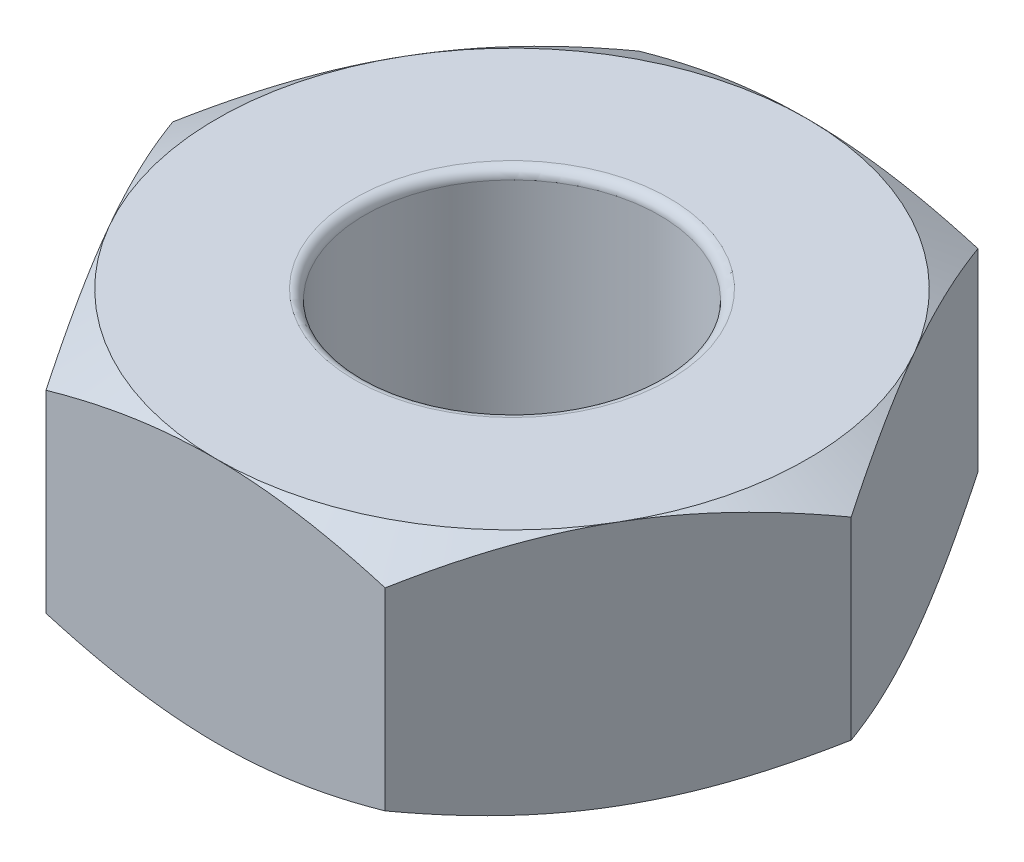
ISO-10303-21;
HEADER;
FILE_DESCRIPTION(('STEP AP214'),'2;1');
FILE_NAME('part.step','',(''),(''),'','','');
FILE_SCHEMA(('AUTOMOTIVE_DESIGN { 1 0 10303 214 1 1 1 1 }'));
ENDSEC;
DATA;
#1=APPLICATION_CONTEXT('core data for automotive mechanical design processes');
#2=APPLICATION_PROTOCOL_DEFINITION('international standard','automotive_design',2000,#1);
#3=PRODUCT_CONTEXT('',#1,'mechanical');
#4=PRODUCT('Part','Part','',(#3));
#5=PRODUCT_RELATED_PRODUCT_CATEGORY('part','',(#4));
#6=PRODUCT_DEFINITION_FORMATION('','',#4);
#7=PRODUCT_DEFINITION_CONTEXT('part definition',#1,'design');
#8=PRODUCT_DEFINITION('design','',#6,#7);
#9=PRODUCT_DEFINITION_SHAPE('','',#8);
#10=(LENGTH_UNIT() NAMED_UNIT(*) SI_UNIT(.MILLI.,.METRE.));
#11=(NAMED_UNIT(*) PLANE_ANGLE_UNIT() SI_UNIT($,.RADIAN.));
#12=(NAMED_UNIT(*) SI_UNIT($,.STERADIAN.) SOLID_ANGLE_UNIT());
#13=UNCERTAINTY_MEASURE_WITH_UNIT(LENGTH_MEASURE(1.E-05),#10,'distance_accuracy_value','');
#14=(GEOMETRIC_REPRESENTATION_CONTEXT(3) GLOBAL_UNCERTAINTY_ASSIGNED_CONTEXT((#13)) GLOBAL_UNIT_ASSIGNED_CONTEXT((#10,
#11,#12)) REPRESENTATION_CONTEXT('',''));
#15=CARTESIAN_POINT('',(0.,0.,0.));
#16=DIRECTION('',(0.,0.,1.));
#17=DIRECTION('',(1.,0.,0.));
#18=AXIS2_PLACEMENT_3D('',#15,#16,#17);
#19=CARTESIAN_POINT('',(1.73203276631956,1.25,0.00790546617274001));
#20=DIRECTION('',(-0.868298494671231,0.,0.496042058853555));
#21=DIRECTION('',(0.496042058853555,0.,0.868298494671231));
#22=AXIS2_PLACEMENT_3D('',#19,#20,#21);
#23=PLANE('',#22);
#24=CARTESIAN_POINT('',(0.872748461580158,0.134041094989057,-1.49623164273341));
#25=CARTESIAN_POINT('',(0.910505710212889,0.112057292544015,-1.4301393395394));
#26=CARTESIAN_POINT('',(0.948588874613615,0.0920633406820825,-1.36347653599026));
#27=CARTESIAN_POINT('',(1.02541474509064,0.057162583785243,-1.22899643194186));
#28=CARTESIAN_POINT('',(1.064158816934,0.0422681272790877,-1.16117674073104));
#29=CARTESIAN_POINT('',(1.14116676684112,0.0190812125993855,-1.02637791513023));
#30=CARTESIAN_POINT('',(1.17941879171193,0.0106344590776262,-0.95941952920179));
#31=CARTESIAN_POINT('',(1.25610296259679,0.000548155951366177,-0.825187463682338));
#32=CARTESIAN_POINT('',(1.29453482961624,-0.00109974319241183,-0.757914272458362));
#33=CARTESIAN_POINT('',(1.36635570965204,0.00231624023372548,-0.632195170805615));
#34=CARTESIAN_POINT('',(1.39975543758004,0.00654137931515019,-0.57373050442362));
#35=CARTESIAN_POINT('',(1.46633727950204,0.0199363876633552,-0.457182094704229));
#36=CARTESIAN_POINT('',(1.49951916295446,0.029110839044217,-0.399098754919133));
#37=CARTESIAN_POINT('',(1.56623844428902,0.0520477516574739,-0.282309763916563));
#38=CARTESIAN_POINT('',(1.59976739156689,0.0659075065061089,-0.223618905087837));
#39=CARTESIAN_POINT('',(1.6663250172453,0.0973642729897473,-0.107112884773709));
#40=CARTESIAN_POINT('',(1.69935454930335,0.114953886453083,-0.0492962290006346));
#41=CARTESIAN_POINT('',(1.73214702243353,0.134041094989057,0.00810546617273983));
#42=B_SPLINE_CURVE_WITH_KNOTS('',3,(#24,#25,#26,#27,#28,#29,#30,#31,#32,#33,#34,#35,#36,#37,#38,
#39,#40,#41),.UNSPECIFIED.,.F.,.F.,(4,2,2,2,2,2,2,2,4),(0.,0.237777780775827,0.476127338905026,
0.708576945847722,0.940741000874616,1.14294310244298,1.3453327264544,1.55221352830934,
1.75868775774927),.UNSPECIFIED.);
#43=CARTESIAN_POINT('',(0.872862717694132,0.133974596215561,-1.49603164273341));
#44=VERTEX_POINT('',#43);
#45=CARTESIAN_POINT('',(1.30244774200685,0.,-0.744063088280333));
#46=VERTEX_POINT('',#45);
#47=EDGE_CURVE('E50',#44,#46,#42,.T.);
#48=ORIENTED_EDGE('',*,*,#47,.F.);
#49=DIRECTION('',(0.,-1.,0.));
#50=VECTOR('',#49,1.);
#51=CARTESIAN_POINT('',(0.872862717694132,1.25,-1.49603164273341));
#52=LINE('',#51,#50);
#53=CARTESIAN_POINT('',(0.872862717694132,1.11602540378444,-1.49603164273341));
#54=VERTEX_POINT('',#53);
#55=EDGE_CURVE('E168',#54,#44,#52,.T.);
#56=ORIENTED_EDGE('',*,*,#55,.F.);
#57=CARTESIAN_POINT('',(1.73214702243353,1.11595890501094,0.00810546617273997));
#58=CARTESIAN_POINT('',(1.6943897738008,1.13794270745599,-0.0579868370212648));
#59=CARTESIAN_POINT('',(1.65630660940008,1.15793665931792,-0.124649640570409));
#60=CARTESIAN_POINT('',(1.57948073892305,1.19283741621476,-0.259129744618806));
#61=CARTESIAN_POINT('',(1.54073666707969,1.20773187272091,-0.326949435829627));
#62=CARTESIAN_POINT('',(1.46372871717257,1.23091878740061,-0.461748261430432));
#63=CARTESIAN_POINT('',(1.42547669230176,1.23936554092237,-0.528706647358876));
#64=CARTESIAN_POINT('',(1.3487925214169,1.24945184404863,-0.662938712878327));
#65=CARTESIAN_POINT('',(1.31036065439745,1.25109974319241,-0.730211904102304));
#66=CARTESIAN_POINT('',(1.23853977436165,1.24768375976627,-0.855931005755051));
#67=CARTESIAN_POINT('',(1.20514004643365,1.24345862068485,-0.914395672137046));
#68=CARTESIAN_POINT('',(1.13855820451165,1.23006361233664,-1.03094408185644));
#69=CARTESIAN_POINT('',(1.10537632105923,1.22088916095578,-1.08902742164153));
#70=CARTESIAN_POINT('',(1.03865703972467,1.19795224834253,-1.2058164126441));
#71=CARTESIAN_POINT('',(1.0051280924468,1.18409249349389,-1.26450727147283));
#72=CARTESIAN_POINT('',(0.938570466768395,1.15263572701025,-1.38101329178696));
#73=CARTESIAN_POINT('',(0.905540934710341,1.13504611354692,-1.43882994756003));
#74=CARTESIAN_POINT('',(0.872748461580158,1.11595890501094,-1.49623164273341));
#75=B_SPLINE_CURVE_WITH_KNOTS('',3,(#57,#58,#59,#60,#61,#62,#63,#64,#65,#66,#67,#68,#69,#70,#71,
#72,#73,#74),.UNSPECIFIED.,.F.,.F.,(4,2,2,2,2,2,2,2,4),(0.,0.237777780775827,0.476127338905026,
0.708576945847721,0.940741000874615,1.14294310244298,1.3453327264544,1.55221352830934,
1.75868775774927),.UNSPECIFIED.);
#76=CARTESIAN_POINT('',(1.30244774200685,1.25,-0.744063088280333));
#77=VERTEX_POINT('',#76);
#78=EDGE_CURVE('E197',#77,#54,#75,.T.);
#79=ORIENTED_EDGE('',*,*,#78,.F.);
#80=CARTESIAN_POINT('',(1.73203276631956,1.11602540378444,0.00790546617274002));
#81=VERTEX_POINT('',#80);
#82=EDGE_CURVE('E159',#81,#77,#75,.T.);
#83=ORIENTED_EDGE('',*,*,#82,.F.);
#84=DIRECTION('',(0.,-1.,0.));
#85=VECTOR('',#84,1.);
#86=CARTESIAN_POINT('',(1.73203276631956,1.25,0.00790546617274001));
#87=LINE('',#86,#85);
#88=CARTESIAN_POINT('',(1.73203276631956,0.13397459621556,0.00790546617274003));
#89=VERTEX_POINT('',#88);
#90=EDGE_CURVE('E154',#81,#89,#87,.T.);
#91=ORIENTED_EDGE('',*,*,#90,.T.);
#92=EDGE_CURVE('E147',#46,#89,#42,.T.);
#93=ORIENTED_EDGE('',*,*,#92,.F.);
#94=EDGE_LOOP('',(#48,#56,#79,#83,#91,#93));
#95=FACE_BOUND('',#94,.T.);
#96=ADVANCED_FACE('F35',(#95),#23,.F.);
#97=CARTESIAN_POINT('',(0.872862717694132,1.25,-1.49603164273341));
#98=DIRECTION('',(-0.00456422302290133,0.,0.999989583879851));
#99=DIRECTION('',(0.999989583879851,0.,0.00456422302290133));
#100=AXIS2_PLACEMENT_3D('',#97,#98,#99);
#101=PLANE('',#100);
#102=CARTESIAN_POINT('',(-0.859370048625427,0.134032336843676,-1.50393802176026));
#103=CARTESIAN_POINT('',(-0.78325432273423,0.112049253599252,-1.50359060899305));
#104=CARTESIAN_POINT('',(-0.706481574441378,0.0920560656525497,-1.50324019739783));
#105=CARTESIAN_POINT('',(-0.55160653396821,0.0571568942661073,-1.50253330580936));
#106=CARTESIAN_POINT('',(-0.473501488815772,0.042263258358237,-1.5021768132508));
#107=CARTESIAN_POINT('',(-0.318259416559701,0.0190779659506211,-1.50146824642997));
#108=CARTESIAN_POINT('',(-0.241146282491906,0.010632019051491,-1.50111628122198));
#109=CARTESIAN_POINT('',(-0.0865569641758218,0.000547274998430949,-1.50041069374674));
#110=CARTESIAN_POINT('',(-0.0090813422368268,-0.00109987103491523,-1.50005707404603));
#111=CARTESIAN_POINT('',(0.135699906808123,0.00231730301084968,-1.49939625325267));
#112=CARTESIAN_POINT('',(0.203027150280744,0.00654258809525845,-1.49908895349707));
#113=CARTESIAN_POINT('',(0.337242977375251,0.0199372020205897,-1.49847635614812));
#114=CARTESIAN_POINT('',(0.404131096383658,0.0291111114063577,-1.49817106067539));
#115=CARTESIAN_POINT('',(0.538623901257774,0.0520463318820197,-1.49755719912491));
#116=CARTESIAN_POINT('',(0.606211555210683,0.0659049148023972,-1.49724871078542));
#117=CARTESIAN_POINT('',(0.740378508496831,0.0973588921011749,-1.49663633650976));
#118=CARTESIAN_POINT('',(0.806959528199758,0.114946890521898,-1.49633244272135));
#119=CARTESIAN_POINT('',(0.873062717694132,0.134032336843676,-1.49603072987929));
#120=B_SPLINE_CURVE_WITH_KNOTS('',3,(#102,#103,#104,#105,#106,#107,#108,#109,#110,#111,#112,
#113,#114,#115,#116,#117,#118,#119),.UNSPECIFIED.,.F.,.F.,(4,2,2,2,2,2,2,2,4),(0.,
0.237775703539285,0.476123127546934,0.708570855718079,0.940733054645261,1.14292173280993,
1.34529788277262,1.55216449729656,1.75862464009075),.UNSPECIFIED.);
#121=CARTESIAN_POINT('',(-0.859170048625427,0.13397459621556,-1.50393710890615));
#122=VERTEX_POINT('',#121);
#123=CARTESIAN_POINT('',(0.006846334534352,0.,-1.49998437581978));
#124=VERTEX_POINT('',#123);
#125=EDGE_CURVE('E58',#122,#124,#120,.T.);
#126=ORIENTED_EDGE('',*,*,#125,.F.);
#127=DIRECTION('',(0.,-1.,0.));
#128=VECTOR('',#127,1.);
#129=CARTESIAN_POINT('',(-0.859170048625427,1.25,-1.50393710890615));
#130=LINE('',#129,#128);
#131=CARTESIAN_POINT('',(-0.859170048625427,1.11602540378444,-1.50393710890615));
#132=VERTEX_POINT('',#131);
#133=EDGE_CURVE('E165',#132,#122,#130,.T.);
#134=ORIENTED_EDGE('',*,*,#133,.F.);
#135=CARTESIAN_POINT('',(0.873062717694132,1.11596766315632,-1.49603072987929));
#136=CARTESIAN_POINT('',(0.796946991802935,1.13795074640075,-1.4963781426465));
#137=CARTESIAN_POINT('',(0.720174243510083,1.15794393434745,-1.49672855424172));
#138=CARTESIAN_POINT('',(0.565299203036915,1.19284310573389,-1.49743544583019));
#139=CARTESIAN_POINT('',(0.487194157884477,1.20773674164176,-1.49779193838875));
#140=CARTESIAN_POINT('',(0.331952085628406,1.23092203404938,-1.49850050520958));
#141=CARTESIAN_POINT('',(0.254838951560611,1.23936798094851,-1.49885247041757));
#142=CARTESIAN_POINT('',(0.100249633244527,1.24945272500157,-1.49955805789281));
#143=CARTESIAN_POINT('',(0.0227740113055318,1.25109987103491,-1.49991167759352));
#144=CARTESIAN_POINT('',(-0.122007237739418,1.24768269698915,-1.50057249838689));
#145=CARTESIAN_POINT('',(-0.189334481212039,1.24345741190474,-1.50087979814248));
#146=CARTESIAN_POINT('',(-0.323550308306545,1.23006279797941,-1.50149239549143));
#147=CARTESIAN_POINT('',(-0.390438427314953,1.22088888859364,-1.50179769096417));
#148=CARTESIAN_POINT('',(-0.524931232189069,1.19795366811798,-1.50241155251464));
#149=CARTESIAN_POINT('',(-0.592518886141978,1.1840950851976,-1.50272004085413));
#150=CARTESIAN_POINT('',(-0.726685839428126,1.15264110789883,-1.50333241512979));
#151=CARTESIAN_POINT('',(-0.793266859131053,1.1350531094781,-1.50363630891821));
#152=CARTESIAN_POINT('',(-0.859370048625427,1.11596766315632,-1.50393802176026));
#153=B_SPLINE_CURVE_WITH_KNOTS('',3,(#135,#136,#137,#138,#139,#140,#141,#142,#143,#144,#145,
#146,#147,#148,#149,#150,#151,#152),.UNSPECIFIED.,.F.,.F.,(4,2,2,2,2,2,2,2,4),(0.,
0.237775703539285,0.476123127546934,0.708570855718079,0.940733054645262,1.14292173280993,
1.34529788277262,1.55216449729656,1.75862464009075),.UNSPECIFIED.);
#154=CARTESIAN_POINT('',(0.006846334534352,1.25,-1.49998437581978));
#155=VERTEX_POINT('',#154);
#156=EDGE_CURVE('E230',#155,#132,#153,.T.);
#157=ORIENTED_EDGE('',*,*,#156,.F.);
#158=EDGE_CURVE('E384',#54,#155,#153,.T.);
#159=ORIENTED_EDGE('',*,*,#158,.F.);
#160=ORIENTED_EDGE('',*,*,#55,.T.);
#161=EDGE_CURVE('E254',#124,#44,#120,.T.);
#162=ORIENTED_EDGE('',*,*,#161,.F.);
#163=EDGE_LOOP('',(#126,#134,#157,#159,#160,#162));
#164=FACE_BOUND('',#163,.T.);
#165=ADVANCED_FACE('F240',(#164),#101,.F.);
#166=CARTESIAN_POINT('',(-0.859170048625427,1.25,-1.50393710890615));
#167=DIRECTION('',(0.86373427164833,0.,0.503947525026295));
#168=DIRECTION('',(0.503947525026295,0.,-0.86373427164833));
#169=AXIS2_PLACEMENT_3D('',#166,#167,#168);
#170=PLANE('',#169);
#171=CARTESIAN_POINT('',(-1.73214945672807,0.134041446423134,-0.0077054661727401));
#172=CARTESIAN_POINT('',(-1.69379045713047,0.112057615119517,-0.0734503720076487));
#173=CARTESIAN_POINT('',(-1.65510034755009,0.0920636326048036,-0.139762779468459));
#174=CARTESIAN_POINT('',(-1.57705007451575,0.0571628120878931,-0.273536024466032));
#175=CARTESIAN_POINT('',(-1.53768852352175,0.0422683226544488,-0.340999240158934));
#176=CARTESIAN_POINT('',(-1.45945326865712,0.0190813428794644,-0.475089532345997));
#177=CARTESIAN_POINT('',(-1.42059160693042,0.0106345569911395,-0.541695969365021));
#178=CARTESIAN_POINT('',(-1.34268529045905,0.000548191305338819,-0.675222481893666));
#179=CARTESIAN_POINT('',(-1.30364091915789,-0.00109973805789227,-0.742142071598986));
#180=CARTESIAN_POINT('',(-1.23067531973265,0.00231619759161642,-0.867200506743905));
#181=CARTESIAN_POINT('',(-1.19674320625145,0.00654133081331652,-0.925358008999022));
#182=CARTESIAN_POINT('',(-1.12910006208653,0.0199363549867208,-1.04129409153904));
#183=CARTESIAN_POINT('',(-1.09538926562148,0.0291108281154816,-1.09907227038794));
#184=CARTESIAN_POINT('',(-1.02760648981092,0.0520478086278354,-1.21524767276139));
#185=CARTESIAN_POINT('',(-0.993543095828079,0.065907610501913,-1.27363018151585));
#186=CARTESIAN_POINT('',(-0.925924552723069,0.0973644889060436,-1.38952409939089));
#187=CARTESIAN_POINT('',(-0.892368536327445,0.114954167175581,-1.44703699496347));
#188=CARTESIAN_POINT('',(-0.859053358216914,0.134041446423135,-1.50413710890615));
#189=B_SPLINE_CURVE_WITH_KNOTS('',3,(#171,#172,#173,#174,#175,#176,#177,#178,#179,#180,#181,
#182,#183,#184,#185,#186,#187,#188),.UNSPECIFIED.,.F.,.F.,(4,2,2,2,2,2,2,2,4),(0.,
0.237777864128074,0.476127507892117,0.708577190223434,0.940741319729197,1.14294395992385,
1.34533412459391,1.55221549572996,1.75869029041058),.UNSPECIFIED.);
#190=CARTESIAN_POINT('',(-1.73203276631956,0.133974596215559,-0.00790546617274003));
#191=VERTEX_POINT('',#190);
#192=CARTESIAN_POINT('',(-1.2956014074725,0.,-0.755921287539443));
#193=VERTEX_POINT('',#192);
#194=EDGE_CURVE('E252',#191,#193,#189,.T.);
#195=ORIENTED_EDGE('',*,*,#194,.F.);
#196=DIRECTION('',(0.,-1.,0.));
#197=VECTOR('',#196,1.);
#198=CARTESIAN_POINT('',(-1.73203276631956,1.25,-0.00790546617274004));
#199=LINE('',#198,#197);
#200=CARTESIAN_POINT('',(-1.73203276631956,1.11602540378444,-0.00790546617274001));
#201=VERTEX_POINT('',#200);
#202=EDGE_CURVE('E156',#201,#191,#199,.T.);
#203=ORIENTED_EDGE('',*,*,#202,.F.);
#204=CARTESIAN_POINT('',(-0.859053358216914,1.11595855357687,-1.50413710890615));
#205=CARTESIAN_POINT('',(-0.897412357814511,1.13794238488048,-1.43839220307124));
#206=CARTESIAN_POINT('',(-0.936102467394899,1.1579363673952,-1.37207979561043));
#207=CARTESIAN_POINT('',(-1.01415274042923,1.19283718791211,-1.23830655061285));
#208=CARTESIAN_POINT('',(-1.05351429142323,1.20773167734555,-1.17084333491995));
#209=CARTESIAN_POINT('',(-1.13174954628787,1.23091865712054,-1.03675304273289));
#210=CARTESIAN_POINT('',(-1.17061120801457,1.23936544300886,-0.970146605713865));
#211=CARTESIAN_POINT('',(-1.24851752448594,1.24945180869466,-0.836620093185221));
#212=CARTESIAN_POINT('',(-1.28756189578709,1.25109973805789,-0.7697005034799));
#213=CARTESIAN_POINT('',(-1.36052749521233,1.24768380240838,-0.644642068334981));
#214=CARTESIAN_POINT('',(-1.39445960869354,1.24345866918668,-0.586484566079864));
#215=CARTESIAN_POINT('',(-1.46210275285846,1.23006364501328,-0.470548483539845));
#216=CARTESIAN_POINT('',(-1.49581354932351,1.22088917188452,-0.41277030469095));
#217=CARTESIAN_POINT('',(-1.56359632513407,1.19795219137217,-0.296594902317499));
#218=CARTESIAN_POINT('',(-1.59765971911691,1.18409238949809,-0.238212393563034));
#219=CARTESIAN_POINT('',(-1.66527826222192,1.15263551109396,-0.122318475687994));
#220=CARTESIAN_POINT('',(-1.69883427861754,1.13504583282442,-0.064805580115421));
#221=CARTESIAN_POINT('',(-1.73214945672807,1.11595855357687,-0.00770546617273987));
#222=B_SPLINE_CURVE_WITH_KNOTS('',3,(#204,#205,#206,#207,#208,#209,#210,#211,#212,#213,#214,
#215,#216,#217,#218,#219,#220,#221),.UNSPECIFIED.,.F.,.F.,(4,2,2,2,2,2,2,2,4),(0.,
0.237777864128074,0.476127507892117,0.708577190223434,0.940741319729198,1.14294395992386,
1.34533412459391,1.55221549572996,1.75869029041058),.UNSPECIFIED.);
#223=CARTESIAN_POINT('',(-1.29560140747249,1.25,-0.755921287539442));
#224=VERTEX_POINT('',#223);
#225=EDGE_CURVE('E222',#224,#201,#222,.T.);
#226=ORIENTED_EDGE('',*,*,#225,.F.);
#227=EDGE_CURVE('E228',#132,#224,#222,.T.);
#228=ORIENTED_EDGE('',*,*,#227,.F.);
#229=ORIENTED_EDGE('',*,*,#133,.T.);
#230=EDGE_CURVE('E246',#193,#122,#189,.T.);
#231=ORIENTED_EDGE('',*,*,#230,.F.);
#232=EDGE_LOOP('',(#195,#203,#226,#228,#229,#231));
#233=FACE_BOUND('',#232,.T.);
#234=ADVANCED_FACE('F236',(#233),#170,.F.);
#235=CARTESIAN_POINT('',(-1.73203276631956,1.25,-0.00790546617274004));
#236=DIRECTION('',(0.868298494671231,0.,-0.496042058853555));
#237=DIRECTION('',(-0.496042058853555,0.,-0.868298494671231));
#238=AXIS2_PLACEMENT_3D('',#235,#236,#237);
#239=PLANE('',#238);
#240=CARTESIAN_POINT('',(-0.872748461580157,0.134041094989056,1.49623164273341));
#241=CARTESIAN_POINT('',(-0.910505710212888,0.112057292544014,1.4301393395394));
#242=CARTESIAN_POINT('',(-0.948588874613614,0.0920633406820821,1.36347653599026));
#243=CARTESIAN_POINT('',(-1.02541474509064,0.0571625837852426,1.22899643194186));
#244=CARTESIAN_POINT('',(-1.064158816934,0.0422681272790873,1.16117674073104));
#245=CARTESIAN_POINT('',(-1.14116676684112,0.019081212599385,1.02637791513023));
#246=CARTESIAN_POINT('',(-1.17941879171193,0.0106344590776256,0.95941952920179));
#247=CARTESIAN_POINT('',(-1.25610296259679,0.000548155951365539,0.825187463682339));
#248=CARTESIAN_POINT('',(-1.29453482961624,-0.00109974319241247,0.757914272458362));
#249=CARTESIAN_POINT('',(-1.36635570965204,0.00231624023372487,0.632195170805615));
#250=CARTESIAN_POINT('',(-1.39975543758004,0.00654137931514962,0.57373050442362));
#251=CARTESIAN_POINT('',(-1.46633727950204,0.0199363876633546,0.457182094704229));
#252=CARTESIAN_POINT('',(-1.49951916295446,0.0291108390442163,0.399098754919133));
#253=CARTESIAN_POINT('',(-1.56623844428902,0.0520477516574731,0.282309763916563));
#254=CARTESIAN_POINT('',(-1.59976739156689,0.0659075065061081,0.223618905087837));
#255=CARTESIAN_POINT('',(-1.6663250172453,0.0973642729897466,0.107112884773709));
#256=CARTESIAN_POINT('',(-1.69935454930335,0.114953886453082,0.0492962290006345));
#257=CARTESIAN_POINT('',(-1.73214702243353,0.134041094989056,-0.00810546617273993));
#258=B_SPLINE_CURVE_WITH_KNOTS('',3,(#240,#241,#242,#243,#244,#245,#246,#247,#248,#249,#250,
#251,#252,#253,#254,#255,#256,#257),.UNSPECIFIED.,.F.,.F.,(4,2,2,2,2,2,2,2,4),(0.,
0.237777780775827,0.476127338905026,0.708576945847721,0.940741000874615,1.14294310244298,
1.3453327264544,1.55221352830934,1.75868775774927),.UNSPECIFIED.);
#259=CARTESIAN_POINT('',(-0.872862717694131,0.13397459621556,1.49603164273341));
#260=VERTEX_POINT('',#259);
#261=CARTESIAN_POINT('',(-1.30244774200685,0.,0.744063088280333));
#262=VERTEX_POINT('',#261);
#263=EDGE_CURVE('E298',#260,#262,#258,.T.);
#264=ORIENTED_EDGE('',*,*,#263,.F.);
#265=DIRECTION('',(0.,-1.,0.));
#266=VECTOR('',#265,1.);
#267=CARTESIAN_POINT('',(-0.872862717694131,1.25,1.49603164273341));
#268=LINE('',#267,#266);
#269=CARTESIAN_POINT('',(-0.872862717694131,1.11602540378444,1.49603164273341));
#270=VERTEX_POINT('',#269);
#271=EDGE_CURVE('E153',#270,#260,#268,.T.);
#272=ORIENTED_EDGE('',*,*,#271,.F.);
#273=CARTESIAN_POINT('',(-1.73214702243353,1.11595890501094,-0.00810546617274003));
#274=CARTESIAN_POINT('',(-1.6943897738008,1.13794270745599,0.0579868370212645));
#275=CARTESIAN_POINT('',(-1.65630660940008,1.15793665931792,0.124649640570408));
#276=CARTESIAN_POINT('',(-1.57948073892305,1.19283741621476,0.259129744618806));
#277=CARTESIAN_POINT('',(-1.54073666707969,1.20773187272091,0.326949435829627));
#278=CARTESIAN_POINT('',(-1.46372871717257,1.23091878740062,0.461748261430432));
#279=CARTESIAN_POINT('',(-1.42547669230176,1.23936554092237,0.528706647358875));
#280=CARTESIAN_POINT('',(-1.3487925214169,1.24945184404863,0.662938712878327));
#281=CARTESIAN_POINT('',(-1.31036065439745,1.25109974319241,0.730211904102304));
#282=CARTESIAN_POINT('',(-1.23853977436165,1.24768375976628,0.85593100575505));
#283=CARTESIAN_POINT('',(-1.20514004643365,1.24345862068485,0.914395672137045));
#284=CARTESIAN_POINT('',(-1.13855820451165,1.23006361233665,1.03094408185644));
#285=CARTESIAN_POINT('',(-1.10537632105923,1.22088916095578,1.08902742164153));
#286=CARTESIAN_POINT('',(-1.03865703972467,1.19795224834253,1.2058164126441));
#287=CARTESIAN_POINT('',(-1.0051280924468,1.18409249349389,1.26450727147283));
#288=CARTESIAN_POINT('',(-0.938570466768394,1.15263572701025,1.38101329178696));
#289=CARTESIAN_POINT('',(-0.90554093471034,1.13504611354692,1.43882994756003));
#290=CARTESIAN_POINT('',(-0.872748461580157,1.11595890501094,1.49623164273341));
#291=B_SPLINE_CURVE_WITH_KNOTS('',3,(#273,#274,#275,#276,#277,#278,#279,#280,#281,#282,#283,
#284,#285,#286,#287,#288,#289,#290),.UNSPECIFIED.,.F.,.F.,(4,2,2,2,2,2,2,2,4),(0.,
0.237777780775827,0.476127338905026,0.708576945847721,0.940741000874614,1.14294310244298,
1.3453327264544,1.55221352830934,1.75868775774927),.UNSPECIFIED.);
#292=CARTESIAN_POINT('',(-1.30244774200685,1.25,0.744063088280332));
#293=VERTEX_POINT('',#292);
#294=EDGE_CURVE('E215',#293,#270,#291,.T.);
#295=ORIENTED_EDGE('',*,*,#294,.F.);
#296=EDGE_CURVE('E229',#201,#293,#291,.T.);
#297=ORIENTED_EDGE('',*,*,#296,.F.);
#298=ORIENTED_EDGE('',*,*,#202,.T.);
#299=EDGE_CURVE('E253',#262,#191,#258,.T.);
#300=ORIENTED_EDGE('',*,*,#299,.F.);
#301=EDGE_LOOP('',(#264,#272,#295,#297,#298,#300));
#302=FACE_BOUND('',#301,.T.);
#303=ADVANCED_FACE('F239',(#302),#239,.F.);
#304=CARTESIAN_POINT('',(-0.872862717694131,1.25,1.49603164273341));
#305=DIRECTION('',(0.00456422302290121,0.,-0.999989583879851));
#306=DIRECTION('',(-0.999989583879851,0.,-0.00456422302290121));
#307=AXIS2_PLACEMENT_3D('',#304,#305,#306);
#308=PLANE('',#307);
#309=CARTESIAN_POINT('',(0.859370048625428,0.134032336843676,1.50393802176026));
#310=CARTESIAN_POINT('',(0.783254322734231,0.112049253599252,1.50359060899305));
#311=CARTESIAN_POINT('',(0.706481574441379,0.0920560656525496,1.50324019739783));
#312=CARTESIAN_POINT('',(0.551606533968211,0.0571568942661072,1.50253330580936));
#313=CARTESIAN_POINT('',(0.473501488815773,0.0422632583582368,1.5021768132508));
#314=CARTESIAN_POINT('',(0.318259416559702,0.0190779659506209,1.50146824642997));
#315=CARTESIAN_POINT('',(0.241146282491907,0.0106320190514908,1.50111628122198));
#316=CARTESIAN_POINT('',(0.0865569641758231,0.000547274998430733,1.50041069374674));
#317=CARTESIAN_POINT('',(0.00908134223682806,-0.00109987103491553,1.50005707404603));
#318=CARTESIAN_POINT('',(-0.135699906808122,0.00231730301084937,1.49939625325267));
#319=CARTESIAN_POINT('',(-0.203027150280743,0.00654258809525819,1.49908895349707));
#320=CARTESIAN_POINT('',(-0.337242977375249,0.0199372020205894,1.49847635614812));
#321=CARTESIAN_POINT('',(-0.404131096383657,0.0291111114063572,1.49817106067539));
#322=CARTESIAN_POINT('',(-0.538623901257773,0.0520463318820191,1.49755719912491));
#323=CARTESIAN_POINT('',(-0.606211555210682,0.0659049148023967,1.49724871078542));
#324=CARTESIAN_POINT('',(-0.74037850849683,0.0973588921011744,1.49663633650976));
#325=CARTESIAN_POINT('',(-0.806959528199757,0.114946890521898,1.49633244272135));
#326=CARTESIAN_POINT('',(-0.873062717694131,0.134032336843676,1.49603072987929));
#327=B_SPLINE_CURVE_WITH_KNOTS('',3,(#309,#310,#311,#312,#313,#314,#315,#316,#317,#318,#319,
#320,#321,#322,#323,#324,#325,#326),.UNSPECIFIED.,.F.,.F.,(4,2,2,2,2,2,2,2,4),(0.,
0.237775703539285,0.476123127546934,0.708570855718079,0.940733054645262,1.14292173280993,
1.34529788277262,1.55216449729656,1.75862464009075),.UNSPECIFIED.);
#328=CARTESIAN_POINT('',(0.859170048625428,0.13397459621556,1.50393710890615));
#329=VERTEX_POINT('',#328);
#330=CARTESIAN_POINT('',(-0.00684633453435181,0.,1.49998437581978));
#331=VERTEX_POINT('',#330);
#332=EDGE_CURVE('E129',#329,#331,#327,.T.);
#333=ORIENTED_EDGE('',*,*,#332,.F.);
#334=DIRECTION('',(0.,-1.,0.));
#335=VECTOR('',#334,1.);
#336=CARTESIAN_POINT('',(0.859170048625428,1.25,1.50393710890615));
#337=LINE('',#336,#335);
#338=CARTESIAN_POINT('',(0.859170048625428,1.11602540378444,1.50393710890615));
#339=VERTEX_POINT('',#338);
#340=EDGE_CURVE('E144',#339,#329,#337,.T.);
#341=ORIENTED_EDGE('',*,*,#340,.F.);
#342=CARTESIAN_POINT('',(-0.873062717694131,1.11596766315632,1.49603072987929));
#343=CARTESIAN_POINT('',(-0.796946991802934,1.13795074640075,1.4963781426465));
#344=CARTESIAN_POINT('',(-0.720174243510082,1.15794393434745,1.49672855424172));
#345=CARTESIAN_POINT('',(-0.565299203036914,1.19284310573389,1.49743544583019));
#346=CARTESIAN_POINT('',(-0.487194157884476,1.20773674164176,1.49779193838875));
#347=CARTESIAN_POINT('',(-0.331952085628406,1.23092203404938,1.49850050520958));
#348=CARTESIAN_POINT('',(-0.254838951560611,1.23936798094851,1.49885247041757));
#349=CARTESIAN_POINT('',(-0.100249633244527,1.24945272500157,1.49955805789281));
#350=CARTESIAN_POINT('',(-0.0227740113055315,1.25109987103492,1.49991167759352));
#351=CARTESIAN_POINT('',(0.122007237739418,1.24768269698915,1.50057249838689));
#352=CARTESIAN_POINT('',(0.189334481212039,1.24345741190474,1.50087979814248));
#353=CARTESIAN_POINT('',(0.323550308306546,1.23006279797941,1.50149239549143));
#354=CARTESIAN_POINT('',(0.390438427314954,1.22088888859364,1.50179769096416));
#355=CARTESIAN_POINT('',(0.52493123218907,1.19795366811798,1.50241155251464));
#356=CARTESIAN_POINT('',(0.592518886141978,1.1840950851976,1.50272004085413));
#357=CARTESIAN_POINT('',(0.726685839428127,1.15264110789883,1.50333241512979));
#358=CARTESIAN_POINT('',(0.793266859131054,1.1350531094781,1.5036363089182));
#359=CARTESIAN_POINT('',(0.859370048625428,1.11596766315632,1.50393802176026));
#360=B_SPLINE_CURVE_WITH_KNOTS('',3,(#342,#343,#344,#345,#346,#347,#348,#349,#350,#351,#352,
#353,#354,#355,#356,#357,#358,#359),.UNSPECIFIED.,.F.,.F.,(4,2,2,2,2,2,2,2,4),(0.,
0.237775703539285,0.476123127546934,0.708570855718078,0.940733054645261,1.14292173280993,
1.34529788277262,1.55216449729656,1.75862464009075),.UNSPECIFIED.);
#361=CARTESIAN_POINT('',(-0.00684633453435181,1.25,1.49998437581978));
#362=VERTEX_POINT('',#361);
#363=EDGE_CURVE('E208',#362,#339,#360,.T.);
#364=ORIENTED_EDGE('',*,*,#363,.F.);
#365=EDGE_CURVE('E268',#270,#362,#360,.T.);
#366=ORIENTED_EDGE('',*,*,#365,.F.);
#367=ORIENTED_EDGE('',*,*,#271,.T.);
#368=EDGE_CURVE('E146',#331,#260,#327,.T.);
#369=ORIENTED_EDGE('',*,*,#368,.F.);
#370=EDGE_LOOP('',(#333,#341,#364,#366,#367,#369));
#371=FACE_BOUND('',#370,.T.);
#372=ADVANCED_FACE('F142',(#371),#308,.F.);
#373=CARTESIAN_POINT('',(0.859170048625428,1.25,1.50393710890615));
#374=DIRECTION('',(-0.86373427164833,0.,-0.503947525026296));
#375=DIRECTION('',(-0.503947525026296,0.,0.86373427164833));
#376=AXIS2_PLACEMENT_3D('',#373,#374,#375);
#377=PLANE('',#376);
#378=CARTESIAN_POINT('',(1.73214945672807,0.134041446423135,0.00770546617274001));
#379=CARTESIAN_POINT('',(1.69379045713048,0.112057615119518,0.0734503720076488));
#380=CARTESIAN_POINT('',(1.65510034755009,0.0920636326048044,0.139762779468459));
#381=CARTESIAN_POINT('',(1.57705007451575,0.0571628120878938,0.273536024466032));
#382=CARTESIAN_POINT('',(1.53768852352175,0.0422683226544495,0.340999240158934));
#383=CARTESIAN_POINT('',(1.45945326865712,0.0190813428794651,0.475089532345997));
#384=CARTESIAN_POINT('',(1.42059160693042,0.0106345569911402,0.541695969365022));
#385=CARTESIAN_POINT('',(1.34268529045905,0.000548191305339533,0.675222481893666));
#386=CARTESIAN_POINT('',(1.30364091915789,-0.00109973805789161,0.742142071598987));
#387=CARTESIAN_POINT('',(1.23067531973265,0.00231619759161702,0.867200506743905));
#388=CARTESIAN_POINT('',(1.19674320625145,0.00654133081331708,0.925358008999022));
#389=CARTESIAN_POINT('',(1.12910006208653,0.0199363549867213,1.04129409153904));
#390=CARTESIAN_POINT('',(1.09538926562148,0.029110828115482,1.09907227038794));
#391=CARTESIAN_POINT('',(1.02760648981092,0.0520478086278357,1.21524767276139));
#392=CARTESIAN_POINT('',(0.99354309582808,0.0659076105019133,1.27363018151585));
#393=CARTESIAN_POINT('',(0.925924552723071,0.0973644889060437,1.38952409939089));
#394=CARTESIAN_POINT('',(0.892368536327446,0.114954167175581,1.44703699496346));
#395=CARTESIAN_POINT('',(0.859053358216915,0.134041446423135,1.50413710890615));
#396=B_SPLINE_CURVE_WITH_KNOTS('',3,(#378,#379,#380,#381,#382,#383,#384,#385,#386,#387,#388,
#389,#390,#391,#392,#393,#394,#395),.UNSPECIFIED.,.F.,.F.,(4,2,2,2,2,2,2,2,4),(0.,
0.237777864128074,0.476127507892117,0.708577190223435,0.940741319729198,1.14294395992386,
1.34533412459391,1.55221549572996,1.75869029041058),.UNSPECIFIED.);
#397=CARTESIAN_POINT('',(1.29560140747249,0.,0.755921287539443));
#398=VERTEX_POINT('',#397);
#399=EDGE_CURVE('E136',#89,#398,#396,.T.);
#400=ORIENTED_EDGE('',*,*,#399,.F.);
#401=ORIENTED_EDGE('',*,*,#90,.F.);
#402=CARTESIAN_POINT('',(0.859053358216915,1.11595855357687,1.50413710890615));
#403=CARTESIAN_POINT('',(0.897412357814512,1.13794238488048,1.43839220307124));
#404=CARTESIAN_POINT('',(0.936102467394901,1.1579363673952,1.37207979561043));
#405=CARTESIAN_POINT('',(1.01415274042923,1.19283718791211,1.23830655061285));
#406=CARTESIAN_POINT('',(1.05351429142324,1.20773167734555,1.17084333491995));
#407=CARTESIAN_POINT('',(1.13174954628787,1.23091865712054,1.03675304273289));
#408=CARTESIAN_POINT('',(1.17061120801457,1.23936544300886,0.970146605713865));
#409=CARTESIAN_POINT('',(1.24851752448594,1.24945180869466,0.83662009318522));
#410=CARTESIAN_POINT('',(1.2875618957871,1.25109973805789,0.7697005034799));
#411=CARTESIAN_POINT('',(1.36052749521234,1.24768380240838,0.644642068334981));
#412=CARTESIAN_POINT('',(1.39445960869354,1.24345866918668,0.586484566079864));
#413=CARTESIAN_POINT('',(1.46210275285846,1.23006364501328,0.470548483539845));
#414=CARTESIAN_POINT('',(1.49581354932351,1.22088917188452,0.41277030469095));
#415=CARTESIAN_POINT('',(1.56359632513407,1.19795219137216,0.2965949023175));
#416=CARTESIAN_POINT('',(1.59765971911691,1.18409238949809,0.238212393563034));
#417=CARTESIAN_POINT('',(1.66527826222192,1.15263551109396,0.122318475687995));
#418=CARTESIAN_POINT('',(1.69883427861754,1.13504583282442,0.0648055801154214));
#419=CARTESIAN_POINT('',(1.73214945672807,1.11595855357687,0.00770546617274019));
#420=B_SPLINE_CURVE_WITH_KNOTS('',3,(#402,#403,#404,#405,#406,#407,#408,#409,#410,#411,#412,
#413,#414,#415,#416,#417,#418,#419),.UNSPECIFIED.,.F.,.F.,(4,2,2,2,2,2,2,2,4),(0.,
0.237777864128074,0.476127507892117,0.708577190223434,0.940741319729198,1.14294395992386,
1.34533412459391,1.55221549572996,1.75869029041058),.UNSPECIFIED.);
#421=CARTESIAN_POINT('',(1.29560140747249,1.25,0.755921287539443));
#422=VERTEX_POINT('',#421);
#423=EDGE_CURVE('E171',#422,#81,#420,.T.);
#424=ORIENTED_EDGE('',*,*,#423,.F.);
#425=EDGE_CURVE('E152',#339,#422,#420,.T.);
#426=ORIENTED_EDGE('',*,*,#425,.F.);
#427=ORIENTED_EDGE('',*,*,#340,.T.);
#428=EDGE_CURVE('E126',#398,#329,#396,.T.);
#429=ORIENTED_EDGE('',*,*,#428,.F.);
#430=EDGE_LOOP('',(#400,#401,#424,#426,#427,#429));
#431=FACE_BOUND('',#430,.T.);
#432=ADVANCED_FACE('F150',(#431),#377,.F.);
#433=CARTESIAN_POINT('',(0.,0.,0.));
#434=DIRECTION('',(0.,1.,0.));
#435=DIRECTION('',(0.,0.,1.));
#436=AXIS2_PLACEMENT_3D('',#433,#434,#435);
#437=PLANE('',#436);
#438=CARTESIAN_POINT('',(0.,0.,0.));
#439=DIRECTION('',(0.,1.,0.));
#440=DIRECTION('',(0.,0.,1.));
#441=AXIS2_PLACEMENT_3D('',#438,#439,#440);
#442=CIRCLE('',#441,0.800000000000001);
#443=CARTESIAN_POINT('',(0.,0.,0.800000000000001));
#444=VERTEX_POINT('',#443);
#445=EDGE_CURVE('E335',#444,#444,#442,.T.);
#446=ORIENTED_EDGE('',*,*,#445,.T.);
#447=EDGE_LOOP('',(#446));
#448=FACE_BOUND('',#447,.T.);
#449=CARTESIAN_POINT('',(0.,0.,0.));
#450=DIRECTION('',(0.,1.,0.));
#451=DIRECTION('',(0.,0.,1.));
#452=AXIS2_PLACEMENT_3D('',#449,#450,#451);
#453=CIRCLE('',#452,1.5);
#454=EDGE_CURVE('E288',#398,#46,#453,.T.);
#455=ORIENTED_EDGE('',*,*,#454,.F.);
#456=EDGE_CURVE('E131',#331,#398,#453,.T.);
#457=ORIENTED_EDGE('',*,*,#456,.F.);
#458=EDGE_CURVE('E290',#262,#331,#453,.T.);
#459=ORIENTED_EDGE('',*,*,#458,.F.);
#460=EDGE_CURVE('E277',#193,#262,#453,.T.);
#461=ORIENTED_EDGE('',*,*,#460,.F.);
#462=EDGE_CURVE('E283',#124,#193,#453,.T.);
#463=ORIENTED_EDGE('',*,*,#462,.F.);
#464=CARTESIAN_POINT('',(0.,0.,0.));
#465=DIRECTION('',(0.,-1.,0.));
#466=DIRECTION('',(0.,0.,-1.));
#467=AXIS2_PLACEMENT_3D('',#464,#465,#466);
#468=CIRCLE('',#467,1.5);
#469=EDGE_CURVE('E137',#124,#46,#468,.T.);
#470=ORIENTED_EDGE('',*,*,#469,.T.);
#471=EDGE_LOOP('',(#455,#457,#459,#461,#463,#470));
#472=FACE_BOUND('',#471,.T.);
#473=ADVANCED_FACE('F289',(#448,#472),#437,.F.);
#474=CARTESIAN_POINT('',(0.,1.25,0.));
#475=DIRECTION('',(0.,1.,0.));
#476=DIRECTION('',(0.,0.,1.));
#477=AXIS2_PLACEMENT_3D('',#474,#475,#476);
#478=PLANE('',#477);
#479=CARTESIAN_POINT('',(0.,1.25,0.));
#480=DIRECTION('',(0.,1.,0.));
#481=DIRECTION('',(0.,0.,1.));
#482=AXIS2_PLACEMENT_3D('',#479,#480,#481);
#483=CIRCLE('',#482,0.800000000000001);
#484=CARTESIAN_POINT('',(0.,1.25,0.800000000000001));
#485=VERTEX_POINT('',#484);
#486=EDGE_CURVE('E12',#485,#485,#483,.F.);
#487=ORIENTED_EDGE('',*,*,#486,.T.);
#488=EDGE_LOOP('',(#487));
#489=FACE_BOUND('',#488,.T.);
#490=CARTESIAN_POINT('',(0.,1.25,0.));
#491=DIRECTION('',(0.,1.,0.));
#492=DIRECTION('',(0.,0.,1.));
#493=AXIS2_PLACEMENT_3D('',#490,#491,#492);
#494=CIRCLE('',#493,1.5);
#495=EDGE_CURVE('E263',#362,#422,#494,.T.);
#496=ORIENTED_EDGE('',*,*,#495,.T.);
#497=EDGE_CURVE('E260',#422,#77,#494,.T.);
#498=ORIENTED_EDGE('',*,*,#497,.T.);
#499=EDGE_CURVE('E262',#77,#155,#494,.T.);
#500=ORIENTED_EDGE('',*,*,#499,.T.);
#501=EDGE_CURVE('E269',#155,#224,#494,.T.);
#502=ORIENTED_EDGE('',*,*,#501,.T.);
#503=EDGE_CURVE('E272',#224,#293,#494,.T.);
#504=ORIENTED_EDGE('',*,*,#503,.T.);
#505=EDGE_CURVE('E270',#293,#362,#494,.T.);
#506=ORIENTED_EDGE('',*,*,#505,.T.);
#507=EDGE_LOOP('',(#496,#498,#500,#502,#504,#506));
#508=FACE_BOUND('',#507,.T.);
#509=ADVANCED_FACE('F343',(#489,#508),#478,.T.);
#510=CARTESIAN_POINT('',(0.,1.25,0.));
#511=DIRECTION('',(0.,-1.,0.));
#512=DIRECTION('',(0.,0.,-1.));
#513=AXIS2_PLACEMENT_3D('',#510,#511,#512);
#514=CYLINDRICAL_SURFACE('',#513,0.750000000000001);
#515=CARTESIAN_POINT('',(0.,0.0499999999999999,0.));
#516=DIRECTION('',(0.,1.,0.));
#517=DIRECTION('',(0.,0.,1.));
#518=AXIS2_PLACEMENT_3D('',#515,#516,#517);
#519=CIRCLE('',#518,0.750000000000001);
#520=CARTESIAN_POINT('',(0.,0.0499999999999999,0.750000000000001));
#521=VERTEX_POINT('',#520);
#522=EDGE_CURVE('E43',#521,#521,#519,.F.);
#523=ORIENTED_EDGE('',*,*,#522,.T.);
#524=EDGE_LOOP('',(#523));
#525=FACE_BOUND('',#524,.T.);
#526=CARTESIAN_POINT('',(0.,1.2,0.));
#527=DIRECTION('',(0.,1.,0.));
#528=DIRECTION('',(0.,0.,1.));
#529=AXIS2_PLACEMENT_3D('',#526,#527,#528);
#530=CIRCLE('',#529,0.750000000000001);
#531=CARTESIAN_POINT('',(0.,1.2,0.750000000000001));
#532=VERTEX_POINT('',#531);
#533=EDGE_CURVE('E337',#532,#532,#530,.T.);
#534=ORIENTED_EDGE('',*,*,#533,.T.);
#535=EDGE_LOOP('',(#534));
#536=FACE_BOUND('',#535,.T.);
#537=ADVANCED_FACE('F189',(#525,#536),#514,.F.);
#538=CARTESIAN_POINT('',(0.,1.25,0.));
#539=DIRECTION('',(0.,-1.,0.));
#540=DIRECTION('',(0.,0.,1.));
#541=AXIS2_PLACEMENT_3D('',#538,#539,#540);
#542=CONICAL_SURFACE('',#541,1.5,1.0471975511966);
#543=ORIENTED_EDGE('',*,*,#82,.T.);
#544=ORIENTED_EDGE('',*,*,#497,.F.);
#545=ORIENTED_EDGE('',*,*,#423,.T.);
#546=EDGE_LOOP('',(#543,#544,#545));
#547=FACE_BOUND('',#546,.T.);
#548=ADVANCED_FACE('F183',(#547),#542,.T.);
#549=ORIENTED_EDGE('',*,*,#363,.T.);
#550=ORIENTED_EDGE('',*,*,#425,.T.);
#551=ORIENTED_EDGE('',*,*,#495,.F.);
#552=EDGE_LOOP('',(#549,#550,#551));
#553=FACE_BOUND('',#552,.T.);
#554=ADVANCED_FACE('F188',(#553),#542,.T.);
#555=ORIENTED_EDGE('',*,*,#294,.T.);
#556=ORIENTED_EDGE('',*,*,#365,.T.);
#557=ORIENTED_EDGE('',*,*,#505,.F.);
#558=EDGE_LOOP('',(#555,#556,#557));
#559=FACE_BOUND('',#558,.T.);
#560=ADVANCED_FACE('F414',(#559),#542,.T.);
#561=ORIENTED_EDGE('',*,*,#225,.T.);
#562=ORIENTED_EDGE('',*,*,#296,.T.);
#563=ORIENTED_EDGE('',*,*,#503,.F.);
#564=EDGE_LOOP('',(#561,#562,#563));
#565=FACE_BOUND('',#564,.T.);
#566=ADVANCED_FACE('F377',(#565),#542,.T.);
#567=ORIENTED_EDGE('',*,*,#156,.T.);
#568=ORIENTED_EDGE('',*,*,#227,.T.);
#569=ORIENTED_EDGE('',*,*,#501,.F.);
#570=EDGE_LOOP('',(#567,#568,#569));
#571=FACE_BOUND('',#570,.T.);
#572=ADVANCED_FACE('F382',(#571),#542,.T.);
#573=ORIENTED_EDGE('',*,*,#78,.T.);
#574=ORIENTED_EDGE('',*,*,#158,.T.);
#575=ORIENTED_EDGE('',*,*,#499,.F.);
#576=EDGE_LOOP('',(#573,#574,#575));
#577=FACE_BOUND('',#576,.T.);
#578=ADVANCED_FACE('F191',(#577),#542,.T.);
#579=CARTESIAN_POINT('',(0.,0.,0.));
#580=DIRECTION('',(0.,1.,0.));
#581=DIRECTION('',(0.,0.,-1.));
#582=AXIS2_PLACEMENT_3D('',#579,#580,#581);
#583=CONICAL_SURFACE('',#582,1.5,1.0471975511966);
#584=ORIENTED_EDGE('',*,*,#332,.T.);
#585=ORIENTED_EDGE('',*,*,#456,.T.);
#586=ORIENTED_EDGE('',*,*,#428,.T.);
#587=EDGE_LOOP('',(#584,#585,#586));
#588=FACE_BOUND('',#587,.T.);
#589=ADVANCED_FACE('F128',(#588),#583,.T.);
#590=ORIENTED_EDGE('',*,*,#263,.T.);
#591=ORIENTED_EDGE('',*,*,#458,.T.);
#592=ORIENTED_EDGE('',*,*,#368,.T.);
#593=EDGE_LOOP('',(#590,#591,#592));
#594=FACE_BOUND('',#593,.T.);
#595=ADVANCED_FACE('F329',(#594),#583,.T.);
#596=ORIENTED_EDGE('',*,*,#194,.T.);
#597=ORIENTED_EDGE('',*,*,#460,.T.);
#598=ORIENTED_EDGE('',*,*,#299,.T.);
#599=EDGE_LOOP('',(#596,#597,#598));
#600=FACE_BOUND('',#599,.T.);
#601=ADVANCED_FACE('F192',(#600),#583,.T.);
#602=ORIENTED_EDGE('',*,*,#230,.T.);
#603=ORIENTED_EDGE('',*,*,#125,.T.);
#604=ORIENTED_EDGE('',*,*,#462,.T.);
#605=EDGE_LOOP('',(#602,#603,#604));
#606=FACE_BOUND('',#605,.T.);
#607=ADVANCED_FACE('F284',(#606),#583,.T.);
#608=ORIENTED_EDGE('',*,*,#161,.T.);
#609=ORIENTED_EDGE('',*,*,#47,.T.);
#610=ORIENTED_EDGE('',*,*,#469,.F.);
#611=EDGE_LOOP('',(#608,#609,#610));
#612=FACE_BOUND('',#611,.T.);
#613=ADVANCED_FACE('F327',(#612),#583,.T.);
#614=ORIENTED_EDGE('',*,*,#92,.T.);
#615=ORIENTED_EDGE('',*,*,#399,.T.);
#616=ORIENTED_EDGE('',*,*,#454,.T.);
#617=EDGE_LOOP('',(#614,#615,#616));
#618=FACE_BOUND('',#617,.T.);
#619=ADVANCED_FACE('F320',(#618),#583,.T.);
#620=CARTESIAN_POINT('',(0.,0.0499999999999999,0.));
#621=DIRECTION('',(0.,1.,0.));
#622=DIRECTION('',(0.,0.,1.));
#623=AXIS2_PLACEMENT_3D('',#620,#621,#622);
#624=TOROIDAL_SURFACE('',#623,0.800000000000001,0.05);
#625=ORIENTED_EDGE('',*,*,#522,.F.);
#626=EDGE_LOOP('',(#625));
#627=FACE_BOUND('',#626,.T.);
#628=ORIENTED_EDGE('',*,*,#445,.F.);
#629=EDGE_LOOP('',(#628));
#630=FACE_BOUND('',#629,.T.);
#631=ADVANCED_FACE('F317',(#627,#630),#624,.T.);
#632=CARTESIAN_POINT('',(0.,1.2,0.));
#633=DIRECTION('',(0.,1.,0.));
#634=DIRECTION('',(0.,0.,1.));
#635=AXIS2_PLACEMENT_3D('',#632,#633,#634);
#636=TOROIDAL_SURFACE('',#635,0.800000000000001,0.05);
#637=ORIENTED_EDGE('',*,*,#486,.F.);
#638=EDGE_LOOP('',(#637));
#639=FACE_BOUND('',#638,.T.);
#640=ORIENTED_EDGE('',*,*,#533,.F.);
#641=EDGE_LOOP('',(#640));
#642=FACE_BOUND('',#641,.T.);
#643=ADVANCED_FACE('F37',(#639,#642),#636,.T.);
#644=CLOSED_SHELL('',(#96,#165,#234,#303,#372,#432,#473,#509,#537,#548,#554,#560,#566,#572,#578,
#589,#595,#601,#607,#613,#619,#631,#643));
#645=MANIFOLD_SOLID_BREP('B2',#644);
#646=ADVANCED_BREP_SHAPE_REPRESENTATION('',(#18,#645),#14);
#647=SHAPE_DEFINITION_REPRESENTATION(#9,#646);
ENDSEC;
END-ISO-10303-21;
